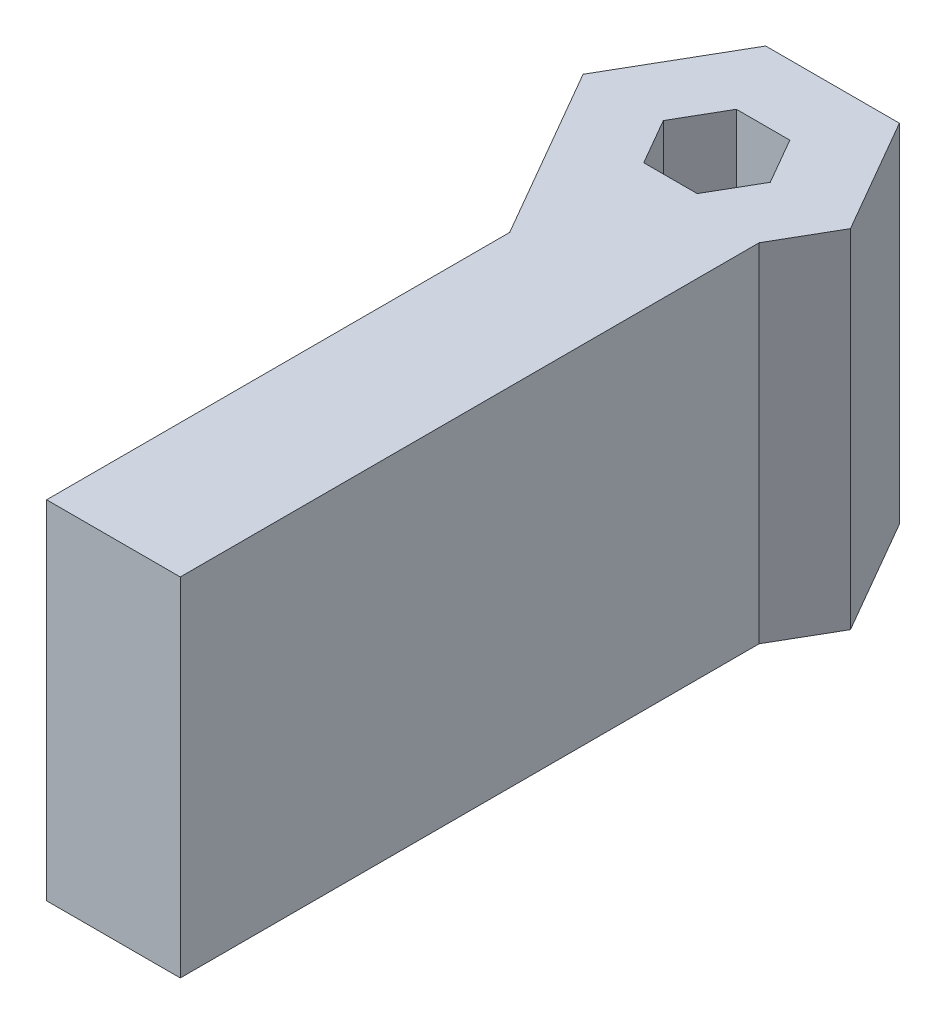
ISO-10303-21;
HEADER;
FILE_DESCRIPTION(('STEP AP214'),'2;1');
FILE_NAME('part.step','',(''),(''),'','','');
FILE_SCHEMA(('AUTOMOTIVE_DESIGN { 1 0 10303 214 1 1 1 1 }'));
ENDSEC;
DATA;
#1=APPLICATION_CONTEXT('core data for automotive mechanical design processes');
#2=APPLICATION_PROTOCOL_DEFINITION('international standard','automotive_design',2000,#1);
#3=PRODUCT_CONTEXT('',#1,'mechanical');
#4=PRODUCT('Part','Part','',(#3));
#5=PRODUCT_RELATED_PRODUCT_CATEGORY('part','',(#4));
#6=PRODUCT_DEFINITION_FORMATION('','',#4);
#7=PRODUCT_DEFINITION_CONTEXT('part definition',#1,'design');
#8=PRODUCT_DEFINITION('design','',#6,#7);
#9=PRODUCT_DEFINITION_SHAPE('','',#8);
#10=(LENGTH_UNIT() NAMED_UNIT(*) SI_UNIT(.MILLI.,.METRE.));
#11=(NAMED_UNIT(*) PLANE_ANGLE_UNIT() SI_UNIT($,.RADIAN.));
#12=(NAMED_UNIT(*) SI_UNIT($,.STERADIAN.) SOLID_ANGLE_UNIT());
#13=UNCERTAINTY_MEASURE_WITH_UNIT(LENGTH_MEASURE(1.E-05),#10,'distance_accuracy_value','');
#14=(GEOMETRIC_REPRESENTATION_CONTEXT(3) GLOBAL_UNCERTAINTY_ASSIGNED_CONTEXT((#13)) GLOBAL_UNIT_ASSIGNED_CONTEXT((#10,
#11,#12)) REPRESENTATION_CONTEXT('',''));
#15=CARTESIAN_POINT('',(0.,0.,0.));
#16=DIRECTION('',(0.,0.,1.));
#17=DIRECTION('',(1.,0.,0.));
#18=AXIS2_PLACEMENT_3D('',#15,#16,#17);
#19=CARTESIAN_POINT('',(0.,15.,0.));
#20=DIRECTION('',(0.,1.,0.));
#21=DIRECTION('',(0.,0.,1.));
#22=AXIS2_PLACEMENT_3D('',#19,#20,#21);
#23=PLANE('',#22);
#24=DIRECTION('',(0.5,0.,-0.866025403784439));
#25=VECTOR('',#24,1.);
#26=CARTESIAN_POINT('',(4.33012701892219,15.,2.5));
#27=LINE('',#26,#25);
#28=CARTESIAN_POINT('',(4.33012701892219,15.,2.5));
#29=VERTEX_POINT('',#28);
#30=CARTESIAN_POINT('',(5.77350269189626,15.,0.));
#31=VERTEX_POINT('',#30);
#32=EDGE_CURVE('E216',#29,#31,#27,.T.);
#33=ORIENTED_EDGE('',*,*,#32,.T.);
#34=DIRECTION('',(-0.5,0.,-0.866025403784439));
#35=VECTOR('',#34,1.);
#36=CARTESIAN_POINT('',(5.77350269189626,15.,0.));
#37=LINE('',#36,#35);
#38=CARTESIAN_POINT('',(2.88675134594813,15.,-5.));
#39=VERTEX_POINT('',#38);
#40=EDGE_CURVE('E220',#31,#39,#37,.T.);
#41=ORIENTED_EDGE('',*,*,#40,.T.);
#42=DIRECTION('',(-1.,0.,0.));
#43=VECTOR('',#42,1.);
#44=CARTESIAN_POINT('',(2.88675134594813,15.,-5.));
#45=LINE('',#44,#43);
#46=CARTESIAN_POINT('',(-2.88675134594813,15.,-5.));
#47=VERTEX_POINT('',#46);
#48=EDGE_CURVE('E224',#39,#47,#45,.T.);
#49=ORIENTED_EDGE('',*,*,#48,.T.);
#50=DIRECTION('',(-0.5,0.,0.866025403784439));
#51=VECTOR('',#50,1.);
#52=CARTESIAN_POINT('',(-2.88675134594813,15.,-5.));
#53=LINE('',#52,#51);
#54=CARTESIAN_POINT('',(-5.77350269189626,15.,0.));
#55=VERTEX_POINT('',#54);
#56=EDGE_CURVE('E227',#47,#55,#53,.T.);
#57=ORIENTED_EDGE('',*,*,#56,.T.);
#58=DIRECTION('',(0.5,0.,0.866025403784438));
#59=VECTOR('',#58,1.);
#60=CARTESIAN_POINT('',(-5.77350269189626,15.,0.));
#61=LINE('',#60,#59);
#62=CARTESIAN_POINT('',(-1.44337567297406,15.,7.5));
#63=VERTEX_POINT('',#62);
#64=EDGE_CURVE('E230',#55,#63,#61,.T.);
#65=ORIENTED_EDGE('',*,*,#64,.T.);
#66=DIRECTION('',(0.,0.,1.));
#67=VECTOR('',#66,1.);
#68=CARTESIAN_POINT('',(-1.44337567297406,15.,7.5));
#69=LINE('',#68,#67);
#70=CARTESIAN_POINT('',(-1.44337567297406,15.,27.5));
#71=VERTEX_POINT('',#70);
#72=EDGE_CURVE('E233',#63,#71,#69,.T.);
#73=ORIENTED_EDGE('',*,*,#72,.T.);
#74=DIRECTION('',(1.,0.,0.));
#75=VECTOR('',#74,1.);
#76=CARTESIAN_POINT('',(-1.44337567297406,15.,27.5));
#77=LINE('',#76,#75);
#78=CARTESIAN_POINT('',(4.33012701892219,15.,27.5));
#79=VERTEX_POINT('',#78);
#80=EDGE_CURVE('E236',#71,#79,#77,.T.);
#81=ORIENTED_EDGE('',*,*,#80,.T.);
#82=DIRECTION('',(0.,0.,-1.));
#83=VECTOR('',#82,1.);
#84=CARTESIAN_POINT('',(4.33012701892219,15.,27.5));
#85=LINE('',#84,#83);
#86=EDGE_CURVE('E239',#79,#29,#85,.T.);
#87=ORIENTED_EDGE('',*,*,#86,.T.);
#88=EDGE_LOOP('',(#33,#41,#49,#57,#65,#73,#81,#87));
#89=FACE_BOUND('',#88,.T.);
#90=DIRECTION('',(-0.500000000000001,0.,-0.866025403784438));
#91=VECTOR('',#90,1.);
#92=CARTESIAN_POINT('',(2.30940107675849,15.,0.));
#93=LINE('',#92,#91);
#94=CARTESIAN_POINT('',(2.30940107675849,15.,0.));
#95=VERTEX_POINT('',#94);
#96=CARTESIAN_POINT('',(1.15470053837924,15.,-1.99999999999999));
#97=VERTEX_POINT('',#96);
#98=EDGE_CURVE('E156',#95,#97,#93,.T.);
#99=ORIENTED_EDGE('',*,*,#98,.F.);
#100=DIRECTION('',(0.499999999999995,0.,-0.866025403784441));
#101=VECTOR('',#100,1.);
#102=CARTESIAN_POINT('',(1.15470053837927,15.,1.99999999999998));
#103=LINE('',#102,#101);
#104=CARTESIAN_POINT('',(1.15470053837927,15.,1.99999999999998));
#105=VERTEX_POINT('',#104);
#106=EDGE_CURVE('E147',#105,#95,#103,.T.);
#107=ORIENTED_EDGE('',*,*,#106,.F.);
#108=DIRECTION('',(1.,0.,0.));
#109=VECTOR('',#108,1.);
#110=CARTESIAN_POINT('',(-1.15470053837923,15.,2.));
#111=LINE('',#110,#109);
#112=CARTESIAN_POINT('',(-1.15470053837923,15.,2.));
#113=VERTEX_POINT('',#112);
#114=EDGE_CURVE('E182',#113,#105,#111,.T.);
#115=ORIENTED_EDGE('',*,*,#114,.F.);
#116=DIRECTION('',(0.500000000000007,0.,0.866025403784434));
#117=VECTOR('',#116,1.);
#118=CARTESIAN_POINT('',(-2.30940107675849,15.,0.));
#119=LINE('',#118,#117);
#120=CARTESIAN_POINT('',(-2.30940107675849,15.,0.));
#121=VERTEX_POINT('',#120);
#122=EDGE_CURVE('E179',#121,#113,#119,.T.);
#123=ORIENTED_EDGE('',*,*,#122,.F.);
#124=DIRECTION('',(-0.499999999999995,0.,0.866025403784442));
#125=VECTOR('',#124,1.);
#126=CARTESIAN_POINT('',(-1.15470053837926,15.,-1.99999999999999));
#127=LINE('',#126,#125);
#128=CARTESIAN_POINT('',(-1.15470053837926,15.,-1.99999999999999));
#129=VERTEX_POINT('',#128);
#130=EDGE_CURVE('E174',#129,#121,#127,.T.);
#131=ORIENTED_EDGE('',*,*,#130,.F.);
#132=DIRECTION('',(-1.,0.,0.));
#133=VECTOR('',#132,1.);
#134=CARTESIAN_POINT('',(1.15470053837924,15.,-1.99999999999999));
#135=LINE('',#134,#133);
#136=EDGE_CURVE('E170',#97,#129,#135,.T.);
#137=ORIENTED_EDGE('',*,*,#136,.F.);
#138=EDGE_LOOP('',(#99,#107,#115,#123,#131,#137));
#139=FACE_BOUND('',#138,.T.);
#140=ADVANCED_FACE('F45',(#89,#139),#23,.T.);
#141=CARTESIAN_POINT('',(0.,0.,0.));
#142=DIRECTION('',(0.,1.,0.));
#143=DIRECTION('',(0.,0.,1.));
#144=AXIS2_PLACEMENT_3D('',#141,#142,#143);
#145=PLANE('',#144);
#146=DIRECTION('',(0.5,0.,-0.866025403784439));
#147=VECTOR('',#146,1.);
#148=CARTESIAN_POINT('',(4.33012701892219,0.,2.5));
#149=LINE('',#148,#147);
#150=CARTESIAN_POINT('',(4.33012701892219,0.,2.5));
#151=VERTEX_POINT('',#150);
#152=CARTESIAN_POINT('',(5.77350269189626,0.,0.));
#153=VERTEX_POINT('',#152);
#154=EDGE_CURVE('E165',#151,#153,#149,.T.);
#155=ORIENTED_EDGE('',*,*,#154,.F.);
#156=DIRECTION('',(0.,0.,-1.));
#157=VECTOR('',#156,1.);
#158=CARTESIAN_POINT('',(4.33012701892219,0.,27.5));
#159=LINE('',#158,#157);
#160=CARTESIAN_POINT('',(4.33012701892219,0.,27.5));
#161=VERTEX_POINT('',#160);
#162=EDGE_CURVE('E221',#161,#151,#159,.T.);
#163=ORIENTED_EDGE('',*,*,#162,.F.);
#164=DIRECTION('',(1.,0.,0.));
#165=VECTOR('',#164,1.);
#166=CARTESIAN_POINT('',(-1.44337567297406,0.,27.5));
#167=LINE('',#166,#165);
#168=CARTESIAN_POINT('',(-1.44337567297406,0.,27.5));
#169=VERTEX_POINT('',#168);
#170=EDGE_CURVE('E261',#169,#161,#167,.T.);
#171=ORIENTED_EDGE('',*,*,#170,.F.);
#172=DIRECTION('',(0.,0.,1.));
#173=VECTOR('',#172,1.);
#174=CARTESIAN_POINT('',(-1.44337567297406,0.,7.5));
#175=LINE('',#174,#173);
#176=CARTESIAN_POINT('',(-1.44337567297406,0.,7.5));
#177=VERTEX_POINT('',#176);
#178=EDGE_CURVE('E258',#177,#169,#175,.T.);
#179=ORIENTED_EDGE('',*,*,#178,.F.);
#180=DIRECTION('',(0.5,0.,0.866025403784438));
#181=VECTOR('',#180,1.);
#182=CARTESIAN_POINT('',(-5.77350269189626,0.,0.));
#183=LINE('',#182,#181);
#184=CARTESIAN_POINT('',(-5.77350269189626,0.,0.));
#185=VERTEX_POINT('',#184);
#186=EDGE_CURVE('E255',#185,#177,#183,.T.);
#187=ORIENTED_EDGE('',*,*,#186,.F.);
#188=DIRECTION('',(-0.5,0.,0.866025403784439));
#189=VECTOR('',#188,1.);
#190=CARTESIAN_POINT('',(-2.88675134594813,0.,-5.));
#191=LINE('',#190,#189);
#192=CARTESIAN_POINT('',(-2.88675134594813,0.,-5.));
#193=VERTEX_POINT('',#192);
#194=EDGE_CURVE('E252',#193,#185,#191,.T.);
#195=ORIENTED_EDGE('',*,*,#194,.F.);
#196=DIRECTION('',(-1.,0.,0.));
#197=VECTOR('',#196,1.);
#198=CARTESIAN_POINT('',(2.88675134594813,0.,-5.));
#199=LINE('',#198,#197);
#200=CARTESIAN_POINT('',(2.88675134594813,0.,-5.));
#201=VERTEX_POINT('',#200);
#202=EDGE_CURVE('E249',#201,#193,#199,.T.);
#203=ORIENTED_EDGE('',*,*,#202,.F.);
#204=DIRECTION('',(-0.5,0.,-0.866025403784439));
#205=VECTOR('',#204,1.);
#206=CARTESIAN_POINT('',(5.77350269189626,0.,0.));
#207=LINE('',#206,#205);
#208=EDGE_CURVE('E246',#153,#201,#207,.T.);
#209=ORIENTED_EDGE('',*,*,#208,.F.);
#210=EDGE_LOOP('',(#155,#163,#171,#179,#187,#195,#203,#209));
#211=FACE_BOUND('',#210,.T.);
#212=DIRECTION('',(0.499999999999995,0.,-0.866025403784441));
#213=VECTOR('',#212,1.);
#214=CARTESIAN_POINT('',(1.15470053837927,0.,1.99999999999998));
#215=LINE('',#214,#213);
#216=CARTESIAN_POINT('',(1.15470053837927,0.,1.99999999999998));
#217=VERTEX_POINT('',#216);
#218=CARTESIAN_POINT('',(2.30940107675849,0.,0.));
#219=VERTEX_POINT('',#218);
#220=EDGE_CURVE('E69',#217,#219,#215,.T.);
#221=ORIENTED_EDGE('',*,*,#220,.T.);
#222=DIRECTION('',(-0.500000000000001,0.,-0.866025403784438));
#223=VECTOR('',#222,1.);
#224=CARTESIAN_POINT('',(2.30940107675849,0.,0.));
#225=LINE('',#224,#223);
#226=CARTESIAN_POINT('',(1.15470053837924,0.,-1.99999999999999));
#227=VERTEX_POINT('',#226);
#228=EDGE_CURVE('E163',#219,#227,#225,.T.);
#229=ORIENTED_EDGE('',*,*,#228,.T.);
#230=DIRECTION('',(-1.,0.,0.));
#231=VECTOR('',#230,1.);
#232=CARTESIAN_POINT('',(1.15470053837924,0.,-1.99999999999999));
#233=LINE('',#232,#231);
#234=CARTESIAN_POINT('',(-1.15470053837926,0.,-1.99999999999999));
#235=VERTEX_POINT('',#234);
#236=EDGE_CURVE('E189',#227,#235,#233,.T.);
#237=ORIENTED_EDGE('',*,*,#236,.T.);
#238=DIRECTION('',(-0.499999999999995,0.,0.866025403784442));
#239=VECTOR('',#238,1.);
#240=CARTESIAN_POINT('',(-1.15470053837926,0.,-1.99999999999999));
#241=LINE('',#240,#239);
#242=CARTESIAN_POINT('',(-2.30940107675849,0.,0.));
#243=VERTEX_POINT('',#242);
#244=EDGE_CURVE('E193',#235,#243,#241,.T.);
#245=ORIENTED_EDGE('',*,*,#244,.T.);
#246=DIRECTION('',(0.500000000000007,0.,0.866025403784434));
#247=VECTOR('',#246,1.);
#248=CARTESIAN_POINT('',(-2.30940107675849,0.,0.));
#249=LINE('',#248,#247);
#250=CARTESIAN_POINT('',(-1.15470053837923,0.,2.));
#251=VERTEX_POINT('',#250);
#252=EDGE_CURVE('E197',#243,#251,#249,.T.);
#253=ORIENTED_EDGE('',*,*,#252,.T.);
#254=DIRECTION('',(1.,0.,0.));
#255=VECTOR('',#254,1.);
#256=CARTESIAN_POINT('',(-1.15470053837923,0.,2.));
#257=LINE('',#256,#255);
#258=EDGE_CURVE('E157',#251,#217,#257,.T.);
#259=ORIENTED_EDGE('',*,*,#258,.T.);
#260=EDGE_LOOP('',(#221,#229,#237,#245,#253,#259));
#261=FACE_BOUND('',#260,.T.);
#262=ADVANCED_FACE('F300',(#211,#261),#145,.F.);
#263=CARTESIAN_POINT('',(4.33012701892219,15.,2.5));
#264=DIRECTION('',(-0.866025403784439,0.,-0.5));
#265=DIRECTION('',(-0.5,0.,0.866025403784439));
#266=AXIS2_PLACEMENT_3D('',#263,#264,#265);
#267=PLANE('',#266);
#268=ORIENTED_EDGE('',*,*,#154,.T.);
#269=DIRECTION('',(0.,-1.,0.));
#270=VECTOR('',#269,1.);
#271=CARTESIAN_POINT('',(5.77350269189626,15.,0.));
#272=LINE('',#271,#270);
#273=EDGE_CURVE('E11',#31,#153,#272,.T.);
#274=ORIENTED_EDGE('',*,*,#273,.F.);
#275=ORIENTED_EDGE('',*,*,#32,.F.);
#276=DIRECTION('',(0.,-1.,0.));
#277=VECTOR('',#276,1.);
#278=CARTESIAN_POINT('',(4.33012701892219,15.,2.5));
#279=LINE('',#278,#277);
#280=EDGE_CURVE('E242',#29,#151,#279,.T.);
#281=ORIENTED_EDGE('',*,*,#280,.T.);
#282=EDGE_LOOP('',(#268,#274,#275,#281));
#283=FACE_BOUND('',#282,.T.);
#284=ADVANCED_FACE('F47',(#283),#267,.F.);
#285=CARTESIAN_POINT('',(5.77350269189626,15.,0.));
#286=DIRECTION('',(-0.866025403784439,0.,0.5));
#287=DIRECTION('',(0.5,0.,0.866025403784439));
#288=AXIS2_PLACEMENT_3D('',#285,#286,#287);
#289=PLANE('',#288);
#290=ORIENTED_EDGE('',*,*,#208,.T.);
#291=DIRECTION('',(0.,-1.,0.));
#292=VECTOR('',#291,1.);
#293=CARTESIAN_POINT('',(2.88675134594813,15.,-5.));
#294=LINE('',#293,#292);
#295=EDGE_CURVE('E54',#39,#201,#294,.T.);
#296=ORIENTED_EDGE('',*,*,#295,.F.);
#297=ORIENTED_EDGE('',*,*,#40,.F.);
#298=ORIENTED_EDGE('',*,*,#273,.T.);
#299=EDGE_LOOP('',(#290,#296,#297,#298));
#300=FACE_BOUND('',#299,.T.);
#301=ADVANCED_FACE('F317',(#300),#289,.F.);
#302=CARTESIAN_POINT('',(2.88675134594813,15.,-5.));
#303=DIRECTION('',(0.,0.,1.));
#304=DIRECTION('',(1.,0.,0.));
#305=AXIS2_PLACEMENT_3D('',#302,#303,#304);
#306=PLANE('',#305);
#307=ORIENTED_EDGE('',*,*,#202,.T.);
#308=DIRECTION('',(0.,-1.,0.));
#309=VECTOR('',#308,1.);
#310=CARTESIAN_POINT('',(-2.88675134594813,15.,-5.));
#311=LINE('',#310,#309);
#312=EDGE_CURVE('E285',#47,#193,#311,.T.);
#313=ORIENTED_EDGE('',*,*,#312,.F.);
#314=ORIENTED_EDGE('',*,*,#48,.F.);
#315=ORIENTED_EDGE('',*,*,#295,.T.);
#316=EDGE_LOOP('',(#307,#313,#314,#315));
#317=FACE_BOUND('',#316,.T.);
#318=ADVANCED_FACE('F294',(#317),#306,.F.);
#319=CARTESIAN_POINT('',(-2.88675134594813,15.,-5.));
#320=DIRECTION('',(0.866025403784439,0.,0.5));
#321=DIRECTION('',(0.5,0.,-0.866025403784439));
#322=AXIS2_PLACEMENT_3D('',#319,#320,#321);
#323=PLANE('',#322);
#324=ORIENTED_EDGE('',*,*,#194,.T.);
#325=DIRECTION('',(0.,-1.,0.));
#326=VECTOR('',#325,1.);
#327=CARTESIAN_POINT('',(-5.77350269189626,15.,0.));
#328=LINE('',#327,#326);
#329=EDGE_CURVE('E281',#55,#185,#328,.T.);
#330=ORIENTED_EDGE('',*,*,#329,.F.);
#331=ORIENTED_EDGE('',*,*,#56,.F.);
#332=ORIENTED_EDGE('',*,*,#312,.T.);
#333=EDGE_LOOP('',(#324,#330,#331,#332));
#334=FACE_BOUND('',#333,.T.);
#335=ADVANCED_FACE('F306',(#334),#323,.F.);
#336=CARTESIAN_POINT('',(-5.77350269189626,15.,0.));
#337=DIRECTION('',(0.866025403784438,0.,-0.5));
#338=DIRECTION('',(-0.5,0.,-0.866025403784439));
#339=AXIS2_PLACEMENT_3D('',#336,#337,#338);
#340=PLANE('',#339);
#341=ORIENTED_EDGE('',*,*,#186,.T.);
#342=DIRECTION('',(0.,-1.,0.));
#343=VECTOR('',#342,1.);
#344=CARTESIAN_POINT('',(-1.44337567297406,15.,7.5));
#345=LINE('',#344,#343);
#346=EDGE_CURVE('E277',#63,#177,#345,.T.);
#347=ORIENTED_EDGE('',*,*,#346,.F.);
#348=ORIENTED_EDGE('',*,*,#64,.F.);
#349=ORIENTED_EDGE('',*,*,#329,.T.);
#350=EDGE_LOOP('',(#341,#347,#348,#349));
#351=FACE_BOUND('',#350,.T.);
#352=ADVANCED_FACE('F310',(#351),#340,.F.);
#353=CARTESIAN_POINT('',(-1.44337567297406,15.,7.5));
#354=DIRECTION('',(1.,0.,0.));
#355=DIRECTION('',(0.,0.,-1.));
#356=AXIS2_PLACEMENT_3D('',#353,#354,#355);
#357=PLANE('',#356);
#358=ORIENTED_EDGE('',*,*,#178,.T.);
#359=DIRECTION('',(0.,-1.,0.));
#360=VECTOR('',#359,1.);
#361=CARTESIAN_POINT('',(-1.44337567297406,15.,27.5));
#362=LINE('',#361,#360);
#363=EDGE_CURVE('E273',#71,#169,#362,.T.);
#364=ORIENTED_EDGE('',*,*,#363,.F.);
#365=ORIENTED_EDGE('',*,*,#72,.F.);
#366=ORIENTED_EDGE('',*,*,#346,.T.);
#367=EDGE_LOOP('',(#358,#364,#365,#366));
#368=FACE_BOUND('',#367,.T.);
#369=ADVANCED_FACE('F330',(#368),#357,.F.);
#370=CARTESIAN_POINT('',(-1.44337567297406,15.,27.5));
#371=DIRECTION('',(0.,0.,-1.));
#372=DIRECTION('',(-1.,0.,0.));
#373=AXIS2_PLACEMENT_3D('',#370,#371,#372);
#374=PLANE('',#373);
#375=ORIENTED_EDGE('',*,*,#170,.T.);
#376=DIRECTION('',(0.,-1.,0.));
#377=VECTOR('',#376,1.);
#378=CARTESIAN_POINT('',(4.33012701892219,15.,27.5));
#379=LINE('',#378,#377);
#380=EDGE_CURVE('E269',#79,#161,#379,.T.);
#381=ORIENTED_EDGE('',*,*,#380,.F.);
#382=ORIENTED_EDGE('',*,*,#80,.F.);
#383=ORIENTED_EDGE('',*,*,#363,.T.);
#384=EDGE_LOOP('',(#375,#381,#382,#383));
#385=FACE_BOUND('',#384,.T.);
#386=ADVANCED_FACE('F328',(#385),#374,.F.);
#387=CARTESIAN_POINT('',(4.33012701892219,15.,27.5));
#388=DIRECTION('',(-1.,0.,0.));
#389=DIRECTION('',(0.,0.,1.));
#390=AXIS2_PLACEMENT_3D('',#387,#388,#389);
#391=PLANE('',#390);
#392=ORIENTED_EDGE('',*,*,#162,.T.);
#393=ORIENTED_EDGE('',*,*,#280,.F.);
#394=ORIENTED_EDGE('',*,*,#86,.F.);
#395=ORIENTED_EDGE('',*,*,#380,.T.);
#396=EDGE_LOOP('',(#392,#393,#394,#395));
#397=FACE_BOUND('',#396,.T.);
#398=ADVANCED_FACE('F323',(#397),#391,.F.);
#399=CARTESIAN_POINT('',(1.15470053837927,15.,1.99999999999998));
#400=DIRECTION('',(-0.866025403784441,0.,-0.499999999999995));
#401=DIRECTION('',(-0.499999999999995,0.,0.866025403784441));
#402=AXIS2_PLACEMENT_3D('',#399,#400,#401);
#403=PLANE('',#402);
#404=ORIENTED_EDGE('',*,*,#220,.F.);
#405=DIRECTION('',(0.,-1.,0.));
#406=VECTOR('',#405,1.);
#407=CARTESIAN_POINT('',(1.15470053837927,15.,1.99999999999998));
#408=LINE('',#407,#406);
#409=EDGE_CURVE('E151',#105,#217,#408,.T.);
#410=ORIENTED_EDGE('',*,*,#409,.F.);
#411=ORIENTED_EDGE('',*,*,#106,.T.);
#412=DIRECTION('',(0.,-1.,0.));
#413=VECTOR('',#412,1.);
#414=CARTESIAN_POINT('',(2.30940107675849,15.,0.));
#415=LINE('',#414,#413);
#416=EDGE_CURVE('E150',#95,#219,#415,.T.);
#417=ORIENTED_EDGE('',*,*,#416,.T.);
#418=EDGE_LOOP('',(#404,#410,#411,#417));
#419=FACE_BOUND('',#418,.T.);
#420=ADVANCED_FACE('F149',(#419),#403,.T.);
#421=CARTESIAN_POINT('',(2.30940107675849,15.,0.));
#422=DIRECTION('',(-0.866025403784438,0.,0.500000000000001));
#423=DIRECTION('',(0.500000000000001,0.,0.866025403784438));
#424=AXIS2_PLACEMENT_3D('',#421,#422,#423);
#425=PLANE('',#424);
#426=ORIENTED_EDGE('',*,*,#228,.F.);
#427=ORIENTED_EDGE('',*,*,#416,.F.);
#428=ORIENTED_EDGE('',*,*,#98,.T.);
#429=DIRECTION('',(0.,-1.,0.));
#430=VECTOR('',#429,1.);
#431=CARTESIAN_POINT('',(1.15470053837924,15.,-1.99999999999999));
#432=LINE('',#431,#430);
#433=EDGE_CURVE('E166',#97,#227,#432,.T.);
#434=ORIENTED_EDGE('',*,*,#433,.T.);
#435=EDGE_LOOP('',(#426,#427,#428,#434));
#436=FACE_BOUND('',#435,.T.);
#437=ADVANCED_FACE('F160',(#436),#425,.T.);
#438=CARTESIAN_POINT('',(1.15470053837924,15.,-1.99999999999999));
#439=DIRECTION('',(0.,0.,1.));
#440=DIRECTION('',(1.,0.,0.));
#441=AXIS2_PLACEMENT_3D('',#438,#439,#440);
#442=PLANE('',#441);
#443=ORIENTED_EDGE('',*,*,#236,.F.);
#444=ORIENTED_EDGE('',*,*,#433,.F.);
#445=ORIENTED_EDGE('',*,*,#136,.T.);
#446=DIRECTION('',(0.,-1.,0.));
#447=VECTOR('',#446,1.);
#448=CARTESIAN_POINT('',(-1.15470053837926,15.,-1.99999999999999));
#449=LINE('',#448,#447);
#450=EDGE_CURVE('E211',#129,#235,#449,.T.);
#451=ORIENTED_EDGE('',*,*,#450,.T.);
#452=EDGE_LOOP('',(#443,#444,#445,#451));
#453=FACE_BOUND('',#452,.T.);
#454=ADVANCED_FACE('F355',(#453),#442,.T.);
#455=CARTESIAN_POINT('',(-1.15470053837926,15.,-1.99999999999999));
#456=DIRECTION('',(0.866025403784442,0.,0.499999999999995));
#457=DIRECTION('',(0.499999999999995,0.,-0.866025403784442));
#458=AXIS2_PLACEMENT_3D('',#455,#456,#457);
#459=PLANE('',#458);
#460=ORIENTED_EDGE('',*,*,#244,.F.);
#461=ORIENTED_EDGE('',*,*,#450,.F.);
#462=ORIENTED_EDGE('',*,*,#130,.T.);
#463=DIRECTION('',(0.,-1.,0.));
#464=VECTOR('',#463,1.);
#465=CARTESIAN_POINT('',(-2.30940107675849,15.,0.));
#466=LINE('',#465,#464);
#467=EDGE_CURVE('E208',#121,#243,#466,.T.);
#468=ORIENTED_EDGE('',*,*,#467,.T.);
#469=EDGE_LOOP('',(#460,#461,#462,#468));
#470=FACE_BOUND('',#469,.T.);
#471=ADVANCED_FACE('F359',(#470),#459,.T.);
#472=CARTESIAN_POINT('',(-2.30940107675849,15.,0.));
#473=DIRECTION('',(0.866025403784435,0.,-0.500000000000007));
#474=DIRECTION('',(-0.500000000000007,0.,-0.866025403784435));
#475=AXIS2_PLACEMENT_3D('',#472,#473,#474);
#476=PLANE('',#475);
#477=ORIENTED_EDGE('',*,*,#252,.F.);
#478=ORIENTED_EDGE('',*,*,#467,.F.);
#479=ORIENTED_EDGE('',*,*,#122,.T.);
#480=DIRECTION('',(0.,-1.,0.));
#481=VECTOR('',#480,1.);
#482=CARTESIAN_POINT('',(-1.15470053837923,15.,2.));
#483=LINE('',#482,#481);
#484=EDGE_CURVE('E61',#113,#251,#483,.T.);
#485=ORIENTED_EDGE('',*,*,#484,.T.);
#486=EDGE_LOOP('',(#477,#478,#479,#485));
#487=FACE_BOUND('',#486,.T.);
#488=ADVANCED_FACE('F365',(#487),#476,.T.);
#489=CARTESIAN_POINT('',(-1.15470053837923,15.,2.));
#490=DIRECTION('',(0.,0.,-1.));
#491=DIRECTION('',(-1.,0.,0.));
#492=AXIS2_PLACEMENT_3D('',#489,#490,#491);
#493=PLANE('',#492);
#494=ORIENTED_EDGE('',*,*,#258,.F.);
#495=ORIENTED_EDGE('',*,*,#484,.F.);
#496=ORIENTED_EDGE('',*,*,#114,.T.);
#497=ORIENTED_EDGE('',*,*,#409,.T.);
#498=EDGE_LOOP('',(#494,#495,#496,#497));
#499=FACE_BOUND('',#498,.T.);
#500=ADVANCED_FACE('F369',(#499),#493,.T.);
#501=CLOSED_SHELL('',(#140,#262,#284,#301,#318,#335,#352,#369,#386,#398,#420,#437,#454,#471,
#488,#500));
#502=MANIFOLD_SOLID_BREP('B2',#501);
#503=ADVANCED_BREP_SHAPE_REPRESENTATION('',(#18,#502),#14);
#504=SHAPE_DEFINITION_REPRESENTATION(#9,#503);
ENDSEC;
END-ISO-10303-21;
